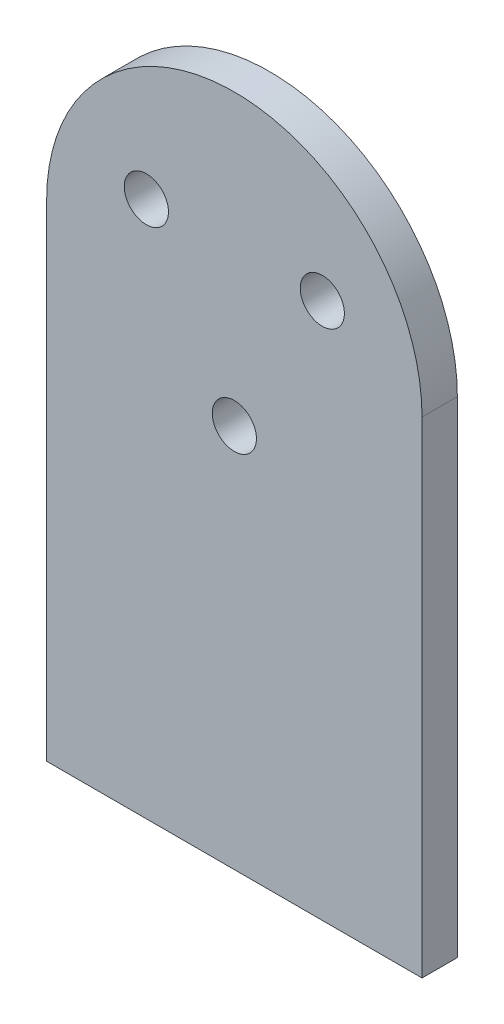
ISO-10303-21;
HEADER;
FILE_DESCRIPTION(('STEP AP214'),'2;1');
FILE_NAME('part.step','',(''),(''),'','','');
FILE_SCHEMA(('AUTOMOTIVE_DESIGN { 1 0 10303 214 1 1 1 1 }'));
ENDSEC;
DATA;
#1=APPLICATION_CONTEXT('core data for automotive mechanical design processes');
#2=APPLICATION_PROTOCOL_DEFINITION('international standard','automotive_design',2000,#1);
#3=PRODUCT_CONTEXT('',#1,'mechanical');
#4=PRODUCT('Part','Part','',(#3));
#5=PRODUCT_RELATED_PRODUCT_CATEGORY('part','',(#4));
#6=PRODUCT_DEFINITION_FORMATION('','',#4);
#7=PRODUCT_DEFINITION_CONTEXT('part definition',#1,'design');
#8=PRODUCT_DEFINITION('design','',#6,#7);
#9=PRODUCT_DEFINITION_SHAPE('','',#8);
#10=(LENGTH_UNIT() NAMED_UNIT(*) SI_UNIT(.MILLI.,.METRE.));
#11=(NAMED_UNIT(*) PLANE_ANGLE_UNIT() SI_UNIT($,.RADIAN.));
#12=(NAMED_UNIT(*) SI_UNIT($,.STERADIAN.) SOLID_ANGLE_UNIT());
#13=UNCERTAINTY_MEASURE_WITH_UNIT(LENGTH_MEASURE(1.E-05),#10,'distance_accuracy_value','');
#14=(GEOMETRIC_REPRESENTATION_CONTEXT(3) GLOBAL_UNCERTAINTY_ASSIGNED_CONTEXT((#13)) GLOBAL_UNIT_ASSIGNED_CONTEXT((#10,
#11,#12)) REPRESENTATION_CONTEXT('',''));
#15=CARTESIAN_POINT('',(0.,0.,0.));
#16=DIRECTION('',(0.,0.,1.));
#17=DIRECTION('',(1.,0.,0.));
#18=AXIS2_PLACEMENT_3D('',#15,#16,#17);
#19=CARTESIAN_POINT('',(0.,0.,0.8));
#20=DIRECTION('',(0.,0.,1.));
#21=DIRECTION('',(1.,0.,0.));
#22=AXIS2_PLACEMENT_3D('',#19,#20,#21);
#23=PLANE('',#22);
#24=CARTESIAN_POINT('',(-1.9918584287042,1.15000000000001,0.8));
#25=DIRECTION('',(0.,0.,1.));
#26=DIRECTION('',(1.,0.,0.));
#27=AXIS2_PLACEMENT_3D('',#24,#25,#26);
#28=CIRCLE('',#27,0.5);
#29=CARTESIAN_POINT('',(-1.4918584287042,1.15000000000001,0.8));
#30=VERTEX_POINT('',#29);
#31=EDGE_CURVE('E134',#30,#30,#28,.T.);
#32=ORIENTED_EDGE('',*,*,#31,.F.);
#33=EDGE_LOOP('',(#32));
#34=FACE_BOUND('',#33,.T.);
#35=CARTESIAN_POINT('',(0.,0.,0.8));
#36=DIRECTION('',(0.,0.,1.));
#37=DIRECTION('',(1.,0.,0.));
#38=AXIS2_PLACEMENT_3D('',#35,#36,#37);
#39=CIRCLE('',#38,4.25);
#40=CARTESIAN_POINT('',(4.25,0.,0.8));
#41=VERTEX_POINT('',#40);
#42=CARTESIAN_POINT('',(-4.25,0.,0.8));
#43=VERTEX_POINT('',#42);
#44=EDGE_CURVE('E92',#41,#43,#39,.T.);
#45=ORIENTED_EDGE('',*,*,#44,.T.);
#46=DIRECTION('',(0.,-1.,0.));
#47=VECTOR('',#46,1.);
#48=CARTESIAN_POINT('',(-4.25,-11.,0.8));
#49=LINE('',#48,#47);
#50=CARTESIAN_POINT('',(-4.25,-11.,0.8));
#51=VERTEX_POINT('',#50);
#52=EDGE_CURVE('E87',#43,#51,#49,.T.);
#53=ORIENTED_EDGE('',*,*,#52,.T.);
#54=DIRECTION('',(1.,0.,0.));
#55=VECTOR('',#54,1.);
#56=CARTESIAN_POINT('',(4.25,-11.,0.8));
#57=LINE('',#56,#55);
#58=CARTESIAN_POINT('',(4.25,-11.,0.8));
#59=VERTEX_POINT('',#58);
#60=EDGE_CURVE('E90',#51,#59,#57,.T.);
#61=ORIENTED_EDGE('',*,*,#60,.T.);
#62=DIRECTION('',(0.,1.,0.));
#63=VECTOR('',#62,1.);
#64=CARTESIAN_POINT('',(4.25,0.,0.8));
#65=LINE('',#64,#63);
#66=EDGE_CURVE('E57',#59,#41,#65,.T.);
#67=ORIENTED_EDGE('',*,*,#66,.T.);
#68=EDGE_LOOP('',(#45,#53,#61,#67));
#69=FACE_BOUND('',#68,.T.);
#70=CARTESIAN_POINT('',(0.,-2.3,0.8));
#71=DIRECTION('',(0.,0.,1.));
#72=DIRECTION('',(1.,0.,0.));
#73=AXIS2_PLACEMENT_3D('',#70,#71,#72);
#74=CIRCLE('',#73,0.5);
#75=CARTESIAN_POINT('',(0.5,-2.3,0.8));
#76=VERTEX_POINT('',#75);
#77=EDGE_CURVE('E112',#76,#76,#74,.T.);
#78=ORIENTED_EDGE('',*,*,#77,.F.);
#79=EDGE_LOOP('',(#78));
#80=FACE_BOUND('',#79,.T.);
#81=CARTESIAN_POINT('',(1.99185842870422,1.14999999999998,0.8));
#82=DIRECTION('',(0.,0.,1.));
#83=DIRECTION('',(1.,0.,0.));
#84=AXIS2_PLACEMENT_3D('',#81,#82,#83);
#85=CIRCLE('',#84,0.5);
#86=CARTESIAN_POINT('',(2.49185842870422,1.14999999999998,0.8));
#87=VERTEX_POINT('',#86);
#88=EDGE_CURVE('E142',#87,#87,#85,.T.);
#89=ORIENTED_EDGE('',*,*,#88,.F.);
#90=EDGE_LOOP('',(#89));
#91=FACE_BOUND('',#90,.T.);
#92=ADVANCED_FACE('F39',(#34,#69,#80,#91),#23,.T.);
#93=CARTESIAN_POINT('',(0.,0.,0.));
#94=DIRECTION('',(0.,0.,1.));
#95=DIRECTION('',(1.,0.,0.));
#96=AXIS2_PLACEMENT_3D('',#93,#94,#95);
#97=PLANE('',#96);
#98=CARTESIAN_POINT('',(0.,0.,0.));
#99=DIRECTION('',(0.,0.,1.));
#100=DIRECTION('',(1.,0.,0.));
#101=AXIS2_PLACEMENT_3D('',#98,#99,#100);
#102=CIRCLE('',#101,4.25);
#103=CARTESIAN_POINT('',(4.25,0.,0.));
#104=VERTEX_POINT('',#103);
#105=CARTESIAN_POINT('',(-4.25,0.,0.));
#106=VERTEX_POINT('',#105);
#107=EDGE_CURVE('E108',#104,#106,#102,.T.);
#108=ORIENTED_EDGE('',*,*,#107,.F.);
#109=DIRECTION('',(0.,1.,0.));
#110=VECTOR('',#109,1.);
#111=CARTESIAN_POINT('',(4.25,0.,0.));
#112=LINE('',#111,#110);
#113=CARTESIAN_POINT('',(4.25,-11.,0.));
#114=VERTEX_POINT('',#113);
#115=EDGE_CURVE('E80',#114,#104,#112,.T.);
#116=ORIENTED_EDGE('',*,*,#115,.F.);
#117=DIRECTION('',(1.,0.,0.));
#118=VECTOR('',#117,1.);
#119=CARTESIAN_POINT('',(4.25,-11.,0.));
#120=LINE('',#119,#118);
#121=CARTESIAN_POINT('',(-4.25,-11.,0.));
#122=VERTEX_POINT('',#121);
#123=EDGE_CURVE('E74',#122,#114,#120,.T.);
#124=ORIENTED_EDGE('',*,*,#123,.F.);
#125=DIRECTION('',(0.,-1.,0.));
#126=VECTOR('',#125,1.);
#127=CARTESIAN_POINT('',(-4.25,-11.,0.));
#128=LINE('',#127,#126);
#129=EDGE_CURVE('E97',#106,#122,#128,.T.);
#130=ORIENTED_EDGE('',*,*,#129,.F.);
#131=EDGE_LOOP('',(#108,#116,#124,#130));
#132=FACE_BOUND('',#131,.T.);
#133=CARTESIAN_POINT('',(0.,-2.3,0.));
#134=DIRECTION('',(0.,0.,1.));
#135=DIRECTION('',(1.,0.,0.));
#136=AXIS2_PLACEMENT_3D('',#133,#134,#135);
#137=CIRCLE('',#136,0.5);
#138=CARTESIAN_POINT('',(0.5,-2.3,0.));
#139=VERTEX_POINT('',#138);
#140=EDGE_CURVE('E130',#139,#139,#137,.T.);
#141=ORIENTED_EDGE('',*,*,#140,.T.);
#142=EDGE_LOOP('',(#141));
#143=FACE_BOUND('',#142,.T.);
#144=CARTESIAN_POINT('',(-1.9918584287042,1.15000000000001,0.));
#145=DIRECTION('',(0.,0.,1.));
#146=DIRECTION('',(1.,0.,0.));
#147=AXIS2_PLACEMENT_3D('',#144,#145,#146);
#148=CIRCLE('',#147,0.5);
#149=CARTESIAN_POINT('',(-1.4918584287042,1.15000000000001,0.));
#150=VERTEX_POINT('',#149);
#151=EDGE_CURVE('E138',#150,#150,#148,.T.);
#152=ORIENTED_EDGE('',*,*,#151,.T.);
#153=EDGE_LOOP('',(#152));
#154=FACE_BOUND('',#153,.T.);
#155=CARTESIAN_POINT('',(1.99185842870422,1.14999999999998,0.));
#156=DIRECTION('',(0.,0.,1.));
#157=DIRECTION('',(1.,0.,0.));
#158=AXIS2_PLACEMENT_3D('',#155,#156,#157);
#159=CIRCLE('',#158,0.5);
#160=CARTESIAN_POINT('',(2.49185842870422,1.14999999999998,0.));
#161=VERTEX_POINT('',#160);
#162=EDGE_CURVE('E146',#161,#161,#159,.T.);
#163=ORIENTED_EDGE('',*,*,#162,.T.);
#164=EDGE_LOOP('',(#163));
#165=FACE_BOUND('',#164,.T.);
#166=ADVANCED_FACE('F125',(#132,#143,#154,#165),#97,.F.);
#167=CARTESIAN_POINT('',(0.,0.,0.8));
#168=DIRECTION('',(0.,0.,-1.));
#169=DIRECTION('',(-1.,0.,0.));
#170=AXIS2_PLACEMENT_3D('',#167,#168,#169);
#171=CYLINDRICAL_SURFACE('',#170,4.25);
#172=ORIENTED_EDGE('',*,*,#107,.T.);
#173=DIRECTION('',(0.,0.,-1.));
#174=VECTOR('',#173,1.);
#175=CARTESIAN_POINT('',(-4.25,0.,0.8));
#176=LINE('',#175,#174);
#177=EDGE_CURVE('E11',#43,#106,#176,.T.);
#178=ORIENTED_EDGE('',*,*,#177,.F.);
#179=ORIENTED_EDGE('',*,*,#44,.F.);
#180=DIRECTION('',(0.,0.,-1.));
#181=VECTOR('',#180,1.);
#182=CARTESIAN_POINT('',(4.25,0.,0.8));
#183=LINE('',#182,#181);
#184=EDGE_CURVE('E104',#41,#104,#183,.T.);
#185=ORIENTED_EDGE('',*,*,#184,.T.);
#186=EDGE_LOOP('',(#172,#178,#179,#185));
#187=FACE_BOUND('',#186,.T.);
#188=ADVANCED_FACE('F41',(#187),#171,.T.);
#189=CARTESIAN_POINT('',(-4.25,-11.,0.8));
#190=DIRECTION('',(1.,0.,0.));
#191=DIRECTION('',(0.,0.,-1.));
#192=AXIS2_PLACEMENT_3D('',#189,#190,#191);
#193=PLANE('',#192);
#194=ORIENTED_EDGE('',*,*,#129,.T.);
#195=DIRECTION('',(0.,0.,-1.));
#196=VECTOR('',#195,1.);
#197=CARTESIAN_POINT('',(-4.25,-11.,0.8));
#198=LINE('',#197,#196);
#199=EDGE_CURVE('E49',#51,#122,#198,.T.);
#200=ORIENTED_EDGE('',*,*,#199,.F.);
#201=ORIENTED_EDGE('',*,*,#52,.F.);
#202=ORIENTED_EDGE('',*,*,#177,.T.);
#203=EDGE_LOOP('',(#194,#200,#201,#202));
#204=FACE_BOUND('',#203,.T.);
#205=ADVANCED_FACE('F96',(#204),#193,.F.);
#206=CARTESIAN_POINT('',(4.25,-11.,0.8));
#207=DIRECTION('',(0.,1.,0.));
#208=DIRECTION('',(0.,0.,1.));
#209=AXIS2_PLACEMENT_3D('',#206,#207,#208);
#210=PLANE('',#209);
#211=ORIENTED_EDGE('',*,*,#123,.T.);
#212=DIRECTION('',(0.,0.,-1.));
#213=VECTOR('',#212,1.);
#214=CARTESIAN_POINT('',(4.25,-11.,0.8));
#215=LINE('',#214,#213);
#216=EDGE_CURVE('E99',#59,#114,#215,.T.);
#217=ORIENTED_EDGE('',*,*,#216,.F.);
#218=ORIENTED_EDGE('',*,*,#60,.F.);
#219=ORIENTED_EDGE('',*,*,#199,.T.);
#220=EDGE_LOOP('',(#211,#217,#218,#219));
#221=FACE_BOUND('',#220,.T.);
#222=ADVANCED_FACE('F100',(#221),#210,.F.);
#223=CARTESIAN_POINT('',(4.25,0.,0.8));
#224=DIRECTION('',(-1.,0.,0.));
#225=DIRECTION('',(0.,0.,1.));
#226=AXIS2_PLACEMENT_3D('',#223,#224,#225);
#227=PLANE('',#226);
#228=ORIENTED_EDGE('',*,*,#115,.T.);
#229=ORIENTED_EDGE('',*,*,#184,.F.);
#230=ORIENTED_EDGE('',*,*,#66,.F.);
#231=ORIENTED_EDGE('',*,*,#216,.T.);
#232=EDGE_LOOP('',(#228,#229,#230,#231));
#233=FACE_BOUND('',#232,.T.);
#234=ADVANCED_FACE('F122',(#233),#227,.F.);
#235=CARTESIAN_POINT('',(0.,-2.3,0.8));
#236=DIRECTION('',(0.,0.,-1.));
#237=DIRECTION('',(-1.,0.,0.));
#238=AXIS2_PLACEMENT_3D('',#235,#236,#237);
#239=CYLINDRICAL_SURFACE('',#238,0.5);
#240=ORIENTED_EDGE('',*,*,#77,.T.);
#241=EDGE_LOOP('',(#240));
#242=FACE_BOUND('',#241,.T.);
#243=ORIENTED_EDGE('',*,*,#140,.F.);
#244=EDGE_LOOP('',(#243));
#245=FACE_BOUND('',#244,.T.);
#246=ADVANCED_FACE('F166',(#242,#245),#239,.F.);
#247=CARTESIAN_POINT('',(-1.9918584287042,1.15000000000001,0.8));
#248=DIRECTION('',(0.,0.,-1.));
#249=DIRECTION('',(-1.,0.,0.));
#250=AXIS2_PLACEMENT_3D('',#247,#248,#249);
#251=CYLINDRICAL_SURFACE('',#250,0.5);
#252=ORIENTED_EDGE('',*,*,#31,.T.);
#253=EDGE_LOOP('',(#252));
#254=FACE_BOUND('',#253,.T.);
#255=ORIENTED_EDGE('',*,*,#151,.F.);
#256=EDGE_LOOP('',(#255));
#257=FACE_BOUND('',#256,.T.);
#258=ADVANCED_FACE('F212',(#254,#257),#251,.F.);
#259=CARTESIAN_POINT('',(1.99185842870422,1.14999999999998,0.8));
#260=DIRECTION('',(0.,0.,-1.));
#261=DIRECTION('',(-1.,0.,0.));
#262=AXIS2_PLACEMENT_3D('',#259,#260,#261);
#263=CYLINDRICAL_SURFACE('',#262,0.5);
#264=ORIENTED_EDGE('',*,*,#88,.T.);
#265=EDGE_LOOP('',(#264));
#266=FACE_BOUND('',#265,.T.);
#267=ORIENTED_EDGE('',*,*,#162,.F.);
#268=EDGE_LOOP('',(#267));
#269=FACE_BOUND('',#268,.T.);
#270=ADVANCED_FACE('F154',(#266,#269),#263,.F.);
#271=CLOSED_SHELL('',(#92,#166,#188,#205,#222,#234,#246,#258,#270));
#272=MANIFOLD_SOLID_BREP('B2',#271);
#273=ADVANCED_BREP_SHAPE_REPRESENTATION('',(#18,#272),#14);
#274=SHAPE_DEFINITION_REPRESENTATION(#9,#273);
ENDSEC;
END-ISO-10303-21;
